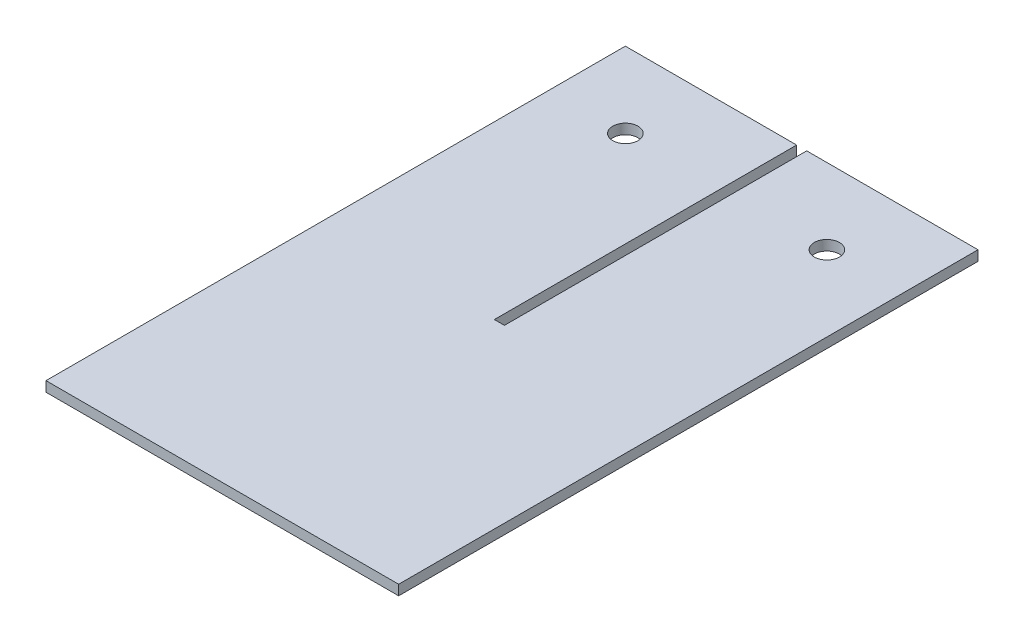
ISO-10303-21;
HEADER;
FILE_DESCRIPTION(('STEP AP214'),'2;1');
FILE_NAME('part.step','',(''),(''),'','','');
FILE_SCHEMA(('AUTOMOTIVE_DESIGN { 1 0 10303 214 1 1 1 1 }'));
ENDSEC;
DATA;
#1=APPLICATION_CONTEXT('core data for automotive mechanical design processes');
#2=APPLICATION_PROTOCOL_DEFINITION('international standard','automotive_design',2000,#1);
#3=PRODUCT_CONTEXT('',#1,'mechanical');
#4=PRODUCT('Part','Part','',(#3));
#5=PRODUCT_RELATED_PRODUCT_CATEGORY('part','',(#4));
#6=PRODUCT_DEFINITION_FORMATION('','',#4);
#7=PRODUCT_DEFINITION_CONTEXT('part definition',#1,'design');
#8=PRODUCT_DEFINITION('design','',#6,#7);
#9=PRODUCT_DEFINITION_SHAPE('','',#8);
#10=(LENGTH_UNIT() NAMED_UNIT(*) SI_UNIT(.MILLI.,.METRE.));
#11=(NAMED_UNIT(*) PLANE_ANGLE_UNIT() SI_UNIT($,.RADIAN.));
#12=(NAMED_UNIT(*) SI_UNIT($,.STERADIAN.) SOLID_ANGLE_UNIT());
#13=UNCERTAINTY_MEASURE_WITH_UNIT(LENGTH_MEASURE(1.E-05),#10,'distance_accuracy_value','');
#14=(GEOMETRIC_REPRESENTATION_CONTEXT(3) GLOBAL_UNCERTAINTY_ASSIGNED_CONTEXT((#13)) GLOBAL_UNIT_ASSIGNED_CONTEXT((#10,
#11,#12)) REPRESENTATION_CONTEXT('',''));
#15=CARTESIAN_POINT('',(0.,0.,0.));
#16=DIRECTION('',(0.,0.,1.));
#17=DIRECTION('',(1.,0.,0.));
#18=AXIS2_PLACEMENT_3D('',#15,#16,#17);
#19=CARTESIAN_POINT('',(0.,2.,0.));
#20=DIRECTION('',(0.,1.,0.));
#21=DIRECTION('',(0.,0.,1.));
#22=AXIS2_PLACEMENT_3D('',#19,#20,#21);
#23=PLANE('',#22);
#24=CARTESIAN_POINT('',(-20.,2.,-42.5));
#25=DIRECTION('',(0.,1.,0.));
#26=DIRECTION('',(0.,0.,1.));
#27=AXIS2_PLACEMENT_3D('',#24,#25,#26);
#28=CIRCLE('',#27,2.5);
#29=CARTESIAN_POINT('',(-20.,2.,-40.));
#30=VERTEX_POINT('',#29);
#31=EDGE_CURVE('E140',#30,#30,#28,.T.);
#32=ORIENTED_EDGE('',*,*,#31,.F.);
#33=EDGE_LOOP('',(#32));
#34=FACE_BOUND('',#33,.T.);
#35=DIRECTION('',(0.,0.,-1.));
#36=VECTOR('',#35,1.);
#37=CARTESIAN_POINT('',(35.,2.,-57.5));
#38=LINE('',#37,#36);
#39=CARTESIAN_POINT('',(35.,2.,57.5));
#40=VERTEX_POINT('',#39);
#41=CARTESIAN_POINT('',(35.,2.,-57.5));
#42=VERTEX_POINT('',#41);
#43=EDGE_CURVE('E151',#40,#42,#38,.T.);
#44=ORIENTED_EDGE('',*,*,#43,.T.);
#45=DIRECTION('',(-1.,0.,0.));
#46=VECTOR('',#45,1.);
#47=CARTESIAN_POINT('',(0.999999999999999,2.,-57.5));
#48=LINE('',#47,#46);
#49=CARTESIAN_POINT('',(0.999999999999999,2.,-57.5));
#50=VERTEX_POINT('',#49);
#51=EDGE_CURVE('E99',#42,#50,#48,.T.);
#52=ORIENTED_EDGE('',*,*,#51,.T.);
#53=DIRECTION('',(0.,0.,1.));
#54=VECTOR('',#53,1.);
#55=CARTESIAN_POINT('',(1.00000000000001,2.,2.5));
#56=LINE('',#55,#54);
#57=CARTESIAN_POINT('',(1.00000000000001,2.,2.5));
#58=VERTEX_POINT('',#57);
#59=EDGE_CURVE('E166',#50,#58,#56,.T.);
#60=ORIENTED_EDGE('',*,*,#59,.T.);
#61=DIRECTION('',(-1.,0.,0.));
#62=VECTOR('',#61,1.);
#63=CARTESIAN_POINT('',(1.00000000000001,2.,2.5));
#64=LINE('',#63,#62);
#65=CARTESIAN_POINT('',(-0.999999999999994,2.,2.5));
#66=VERTEX_POINT('',#65);
#67=EDGE_CURVE('E179',#58,#66,#64,.T.);
#68=ORIENTED_EDGE('',*,*,#67,.T.);
#69=DIRECTION('',(0.,0.,-1.));
#70=VECTOR('',#69,1.);
#71=CARTESIAN_POINT('',(-0.999999999999994,2.,2.5));
#72=LINE('',#71,#70);
#73=CARTESIAN_POINT('',(-1.,2.,-57.5));
#74=VERTEX_POINT('',#73);
#75=EDGE_CURVE('E118',#66,#74,#72,.T.);
#76=ORIENTED_EDGE('',*,*,#75,.T.);
#77=DIRECTION('',(-1.,0.,0.));
#78=VECTOR('',#77,1.);
#79=CARTESIAN_POINT('',(-35.,2.,-57.5));
#80=LINE('',#79,#78);
#81=CARTESIAN_POINT('',(-35.,2.,-57.5));
#82=VERTEX_POINT('',#81);
#83=EDGE_CURVE('E112',#74,#82,#80,.T.);
#84=ORIENTED_EDGE('',*,*,#83,.T.);
#85=DIRECTION('',(0.,0.,1.));
#86=VECTOR('',#85,1.);
#87=CARTESIAN_POINT('',(-35.,2.,-57.5));
#88=LINE('',#87,#86);
#89=CARTESIAN_POINT('',(-35.,2.,57.5));
#90=VERTEX_POINT('',#89);
#91=EDGE_CURVE('E116',#82,#90,#88,.T.);
#92=ORIENTED_EDGE('',*,*,#91,.T.);
#93=DIRECTION('',(1.,0.,0.));
#94=VECTOR('',#93,1.);
#95=CARTESIAN_POINT('',(-35.,2.,57.5));
#96=LINE('',#95,#94);
#97=EDGE_CURVE('E56',#90,#40,#96,.T.);
#98=ORIENTED_EDGE('',*,*,#97,.T.);
#99=EDGE_LOOP('',(#44,#52,#60,#68,#76,#84,#92,#98));
#100=FACE_BOUND('',#99,.T.);
#101=CARTESIAN_POINT('',(20.,2.,-42.5));
#102=DIRECTION('',(0.,1.,0.));
#103=DIRECTION('',(0.,0.,1.));
#104=AXIS2_PLACEMENT_3D('',#101,#102,#103);
#105=CIRCLE('',#104,2.5);
#106=CARTESIAN_POINT('',(20.,2.,-40.));
#107=VERTEX_POINT('',#106);
#108=EDGE_CURVE('E188',#107,#107,#105,.T.);
#109=ORIENTED_EDGE('',*,*,#108,.F.);
#110=EDGE_LOOP('',(#109));
#111=FACE_BOUND('',#110,.T.);
#112=ADVANCED_FACE('F39',(#34,#100,#111),#23,.T.);
#113=CARTESIAN_POINT('',(0.,0.,0.));
#114=DIRECTION('',(0.,1.,0.));
#115=DIRECTION('',(0.,0.,1.));
#116=AXIS2_PLACEMENT_3D('',#113,#114,#115);
#117=PLANE('',#116);
#118=DIRECTION('',(0.,0.,-1.));
#119=VECTOR('',#118,1.);
#120=CARTESIAN_POINT('',(35.,0.,-57.5));
#121=LINE('',#120,#119);
#122=CARTESIAN_POINT('',(35.,0.,57.5));
#123=VERTEX_POINT('',#122);
#124=CARTESIAN_POINT('',(35.,0.,-57.5));
#125=VERTEX_POINT('',#124);
#126=EDGE_CURVE('E136',#123,#125,#121,.T.);
#127=ORIENTED_EDGE('',*,*,#126,.F.);
#128=DIRECTION('',(1.,0.,0.));
#129=VECTOR('',#128,1.);
#130=CARTESIAN_POINT('',(-35.,0.,57.5));
#131=LINE('',#130,#129);
#132=CARTESIAN_POINT('',(-35.,0.,57.5));
#133=VERTEX_POINT('',#132);
#134=EDGE_CURVE('E91',#133,#123,#131,.T.);
#135=ORIENTED_EDGE('',*,*,#134,.F.);
#136=DIRECTION('',(0.,0.,1.));
#137=VECTOR('',#136,1.);
#138=CARTESIAN_POINT('',(-35.,0.,-57.5));
#139=LINE('',#138,#137);
#140=CARTESIAN_POINT('',(-35.,0.,-57.5));
#141=VERTEX_POINT('',#140);
#142=EDGE_CURVE('E85',#141,#133,#139,.T.);
#143=ORIENTED_EDGE('',*,*,#142,.F.);
#144=DIRECTION('',(-1.,0.,0.));
#145=VECTOR('',#144,1.);
#146=CARTESIAN_POINT('',(-35.,0.,-57.5));
#147=LINE('',#146,#145);
#148=CARTESIAN_POINT('',(-1.,0.,-57.5));
#149=VERTEX_POINT('',#148);
#150=EDGE_CURVE('E126',#149,#141,#147,.T.);
#151=ORIENTED_EDGE('',*,*,#150,.F.);
#152=DIRECTION('',(0.,0.,-1.));
#153=VECTOR('',#152,1.);
#154=CARTESIAN_POINT('',(-0.999999999999994,0.,2.5));
#155=LINE('',#154,#153);
#156=CARTESIAN_POINT('',(-0.999999999999994,0.,2.5));
#157=VERTEX_POINT('',#156);
#158=EDGE_CURVE('E146',#157,#149,#155,.T.);
#159=ORIENTED_EDGE('',*,*,#158,.F.);
#160=DIRECTION('',(-1.,0.,0.));
#161=VECTOR('',#160,1.);
#162=CARTESIAN_POINT('',(1.00000000000001,0.,2.5));
#163=LINE('',#162,#161);
#164=CARTESIAN_POINT('',(1.00000000000001,0.,2.5));
#165=VERTEX_POINT('',#164);
#166=EDGE_CURVE('E144',#165,#157,#163,.T.);
#167=ORIENTED_EDGE('',*,*,#166,.F.);
#168=DIRECTION('',(0.,0.,1.));
#169=VECTOR('',#168,1.);
#170=CARTESIAN_POINT('',(1.00000000000001,0.,2.5));
#171=LINE('',#170,#169);
#172=CARTESIAN_POINT('',(0.999999999999999,0.,-57.5));
#173=VERTEX_POINT('',#172);
#174=EDGE_CURVE('E142',#173,#165,#171,.T.);
#175=ORIENTED_EDGE('',*,*,#174,.F.);
#176=DIRECTION('',(-1.,0.,0.));
#177=VECTOR('',#176,1.);
#178=CARTESIAN_POINT('',(0.999999999999999,0.,-57.5));
#179=LINE('',#178,#177);
#180=EDGE_CURVE('E139',#125,#173,#179,.T.);
#181=ORIENTED_EDGE('',*,*,#180,.F.);
#182=EDGE_LOOP('',(#127,#135,#143,#151,#159,#167,#175,#181));
#183=FACE_BOUND('',#182,.T.);
#184=CARTESIAN_POINT('',(-20.,0.,-42.5));
#185=DIRECTION('',(0.,1.,0.));
#186=DIRECTION('',(0.,0.,1.));
#187=AXIS2_PLACEMENT_3D('',#184,#185,#186);
#188=CIRCLE('',#187,2.5);
#189=CARTESIAN_POINT('',(-20.,0.,-40.));
#190=VERTEX_POINT('',#189);
#191=EDGE_CURVE('E185',#190,#190,#188,.T.);
#192=ORIENTED_EDGE('',*,*,#191,.T.);
#193=EDGE_LOOP('',(#192));
#194=FACE_BOUND('',#193,.T.);
#195=CARTESIAN_POINT('',(20.,0.,-42.5));
#196=DIRECTION('',(0.,1.,0.));
#197=DIRECTION('',(0.,0.,1.));
#198=AXIS2_PLACEMENT_3D('',#195,#196,#197);
#199=CIRCLE('',#198,2.5);
#200=CARTESIAN_POINT('',(20.,0.,-40.));
#201=VERTEX_POINT('',#200);
#202=EDGE_CURVE('E191',#201,#201,#199,.T.);
#203=ORIENTED_EDGE('',*,*,#202,.T.);
#204=EDGE_LOOP('',(#203));
#205=FACE_BOUND('',#204,.T.);
#206=ADVANCED_FACE('F170',(#183,#194,#205),#117,.F.);
#207=CARTESIAN_POINT('',(35.,2.,-57.5));
#208=DIRECTION('',(-1.,0.,0.));
#209=DIRECTION('',(0.,0.,1.));
#210=AXIS2_PLACEMENT_3D('',#207,#208,#209);
#211=PLANE('',#210);
#212=ORIENTED_EDGE('',*,*,#126,.T.);
#213=DIRECTION('',(0.,-1.,0.));
#214=VECTOR('',#213,1.);
#215=CARTESIAN_POINT('',(35.,2.,-57.5));
#216=LINE('',#215,#214);
#217=EDGE_CURVE('E11',#42,#125,#216,.T.);
#218=ORIENTED_EDGE('',*,*,#217,.F.);
#219=ORIENTED_EDGE('',*,*,#43,.F.);
#220=DIRECTION('',(0.,-1.,0.));
#221=VECTOR('',#220,1.);
#222=CARTESIAN_POINT('',(35.,2.,57.5));
#223=LINE('',#222,#221);
#224=EDGE_CURVE('E132',#40,#123,#223,.T.);
#225=ORIENTED_EDGE('',*,*,#224,.T.);
#226=EDGE_LOOP('',(#212,#218,#219,#225));
#227=FACE_BOUND('',#226,.T.);
#228=ADVANCED_FACE('F41',(#227),#211,.F.);
#229=CARTESIAN_POINT('',(0.999999999999999,2.,-57.5));
#230=DIRECTION('',(0.,0.,1.));
#231=DIRECTION('',(1.,0.,0.));
#232=AXIS2_PLACEMENT_3D('',#229,#230,#231);
#233=PLANE('',#232);
#234=ORIENTED_EDGE('',*,*,#180,.T.);
#235=DIRECTION('',(0.,-1.,0.));
#236=VECTOR('',#235,1.);
#237=CARTESIAN_POINT('',(0.999999999999999,2.,-57.5));
#238=LINE('',#237,#236);
#239=EDGE_CURVE('E48',#50,#173,#238,.T.);
#240=ORIENTED_EDGE('',*,*,#239,.F.);
#241=ORIENTED_EDGE('',*,*,#51,.F.);
#242=ORIENTED_EDGE('',*,*,#217,.T.);
#243=EDGE_LOOP('',(#234,#240,#241,#242));
#244=FACE_BOUND('',#243,.T.);
#245=ADVANCED_FACE('F223',(#244),#233,.F.);
#246=CARTESIAN_POINT('',(1.00000000000001,2.,2.5));
#247=DIRECTION('',(1.,0.,0.));
#248=DIRECTION('',(0.,0.,-1.));
#249=AXIS2_PLACEMENT_3D('',#246,#247,#248);
#250=PLANE('',#249);
#251=ORIENTED_EDGE('',*,*,#174,.T.);
#252=DIRECTION('',(0.,-1.,0.));
#253=VECTOR('',#252,1.);
#254=CARTESIAN_POINT('',(1.00000000000001,2.,2.5));
#255=LINE('',#254,#253);
#256=EDGE_CURVE('E158',#58,#165,#255,.T.);
#257=ORIENTED_EDGE('',*,*,#256,.F.);
#258=ORIENTED_EDGE('',*,*,#59,.F.);
#259=ORIENTED_EDGE('',*,*,#239,.T.);
#260=EDGE_LOOP('',(#251,#257,#258,#259));
#261=FACE_BOUND('',#260,.T.);
#262=ADVANCED_FACE('F164',(#261),#250,.F.);
#263=CARTESIAN_POINT('',(1.00000000000001,2.,2.5));
#264=DIRECTION('',(0.,0.,1.));
#265=DIRECTION('',(1.,0.,0.));
#266=AXIS2_PLACEMENT_3D('',#263,#264,#265);
#267=PLANE('',#266);
#268=ORIENTED_EDGE('',*,*,#166,.T.);
#269=DIRECTION('',(0.,-1.,0.));
#270=VECTOR('',#269,1.);
#271=CARTESIAN_POINT('',(-0.999999999999994,2.,2.5));
#272=LINE('',#271,#270);
#273=EDGE_CURVE('E155',#66,#157,#272,.T.);
#274=ORIENTED_EDGE('',*,*,#273,.F.);
#275=ORIENTED_EDGE('',*,*,#67,.F.);
#276=ORIENTED_EDGE('',*,*,#256,.T.);
#277=EDGE_LOOP('',(#268,#274,#275,#276));
#278=FACE_BOUND('',#277,.T.);
#279=ADVANCED_FACE('F175',(#278),#267,.F.);
#280=CARTESIAN_POINT('',(-0.999999999999994,2.,2.5));
#281=DIRECTION('',(-1.,0.,0.));
#282=DIRECTION('',(0.,0.,1.));
#283=AXIS2_PLACEMENT_3D('',#280,#281,#282);
#284=PLANE('',#283);
#285=ORIENTED_EDGE('',*,*,#158,.T.);
#286=DIRECTION('',(0.,-1.,0.));
#287=VECTOR('',#286,1.);
#288=CARTESIAN_POINT('',(-1.,2.,-57.5));
#289=LINE('',#288,#287);
#290=EDGE_CURVE('E127',#74,#149,#289,.T.);
#291=ORIENTED_EDGE('',*,*,#290,.F.);
#292=ORIENTED_EDGE('',*,*,#75,.F.);
#293=ORIENTED_EDGE('',*,*,#273,.T.);
#294=EDGE_LOOP('',(#285,#291,#292,#293));
#295=FACE_BOUND('',#294,.T.);
#296=ADVANCED_FACE('F178',(#295),#284,.F.);
#297=CARTESIAN_POINT('',(-35.,2.,-57.5));
#298=DIRECTION('',(0.,0.,1.));
#299=DIRECTION('',(1.,0.,0.));
#300=AXIS2_PLACEMENT_3D('',#297,#298,#299);
#301=PLANE('',#300);
#302=ORIENTED_EDGE('',*,*,#150,.T.);
#303=DIRECTION('',(0.,-1.,0.));
#304=VECTOR('',#303,1.);
#305=CARTESIAN_POINT('',(-35.,2.,-57.5));
#306=LINE('',#305,#304);
#307=EDGE_CURVE('E123',#82,#141,#306,.T.);
#308=ORIENTED_EDGE('',*,*,#307,.F.);
#309=ORIENTED_EDGE('',*,*,#83,.F.);
#310=ORIENTED_EDGE('',*,*,#290,.T.);
#311=EDGE_LOOP('',(#302,#308,#309,#310));
#312=FACE_BOUND('',#311,.T.);
#313=ADVANCED_FACE('F124',(#312),#301,.F.);
#314=CARTESIAN_POINT('',(-35.,2.,-57.5));
#315=DIRECTION('',(1.,0.,0.));
#316=DIRECTION('',(0.,0.,-1.));
#317=AXIS2_PLACEMENT_3D('',#314,#315,#316);
#318=PLANE('',#317);
#319=ORIENTED_EDGE('',*,*,#142,.T.);
#320=DIRECTION('',(0.,-1.,0.));
#321=VECTOR('',#320,1.);
#322=CARTESIAN_POINT('',(-35.,2.,57.5));
#323=LINE('',#322,#321);
#324=EDGE_CURVE('E128',#90,#133,#323,.T.);
#325=ORIENTED_EDGE('',*,*,#324,.F.);
#326=ORIENTED_EDGE('',*,*,#91,.F.);
#327=ORIENTED_EDGE('',*,*,#307,.T.);
#328=EDGE_LOOP('',(#319,#325,#326,#327));
#329=FACE_BOUND('',#328,.T.);
#330=ADVANCED_FACE('F130',(#329),#318,.F.);
#331=CARTESIAN_POINT('',(-35.,2.,57.5));
#332=DIRECTION('',(0.,0.,-1.));
#333=DIRECTION('',(-1.,0.,0.));
#334=AXIS2_PLACEMENT_3D('',#331,#332,#333);
#335=PLANE('',#334);
#336=ORIENTED_EDGE('',*,*,#134,.T.);
#337=ORIENTED_EDGE('',*,*,#224,.F.);
#338=ORIENTED_EDGE('',*,*,#97,.F.);
#339=ORIENTED_EDGE('',*,*,#324,.T.);
#340=EDGE_LOOP('',(#336,#337,#338,#339));
#341=FACE_BOUND('',#340,.T.);
#342=ADVANCED_FACE('F211',(#341),#335,.F.);
#343=CARTESIAN_POINT('',(-20.,2.,-42.5));
#344=DIRECTION('',(0.,-1.,0.));
#345=DIRECTION('',(0.,0.,-1.));
#346=AXIS2_PLACEMENT_3D('',#343,#344,#345);
#347=CYLINDRICAL_SURFACE('',#346,2.5);
#348=ORIENTED_EDGE('',*,*,#31,.T.);
#349=EDGE_LOOP('',(#348));
#350=FACE_BOUND('',#349,.T.);
#351=ORIENTED_EDGE('',*,*,#191,.F.);
#352=EDGE_LOOP('',(#351));
#353=FACE_BOUND('',#352,.T.);
#354=ADVANCED_FACE('F208',(#350,#353),#347,.F.);
#355=CARTESIAN_POINT('',(20.,2.,-42.5));
#356=DIRECTION('',(0.,-1.,0.));
#357=DIRECTION('',(0.,0.,-1.));
#358=AXIS2_PLACEMENT_3D('',#355,#356,#357);
#359=CYLINDRICAL_SURFACE('',#358,2.5);
#360=ORIENTED_EDGE('',*,*,#108,.T.);
#361=EDGE_LOOP('',(#360));
#362=FACE_BOUND('',#361,.T.);
#363=ORIENTED_EDGE('',*,*,#202,.F.);
#364=EDGE_LOOP('',(#363));
#365=FACE_BOUND('',#364,.T.);
#366=ADVANCED_FACE('F197',(#362,#365),#359,.F.);
#367=CLOSED_SHELL('',(#112,#206,#228,#245,#262,#279,#296,#313,#330,#342,#354,#366));
#368=MANIFOLD_SOLID_BREP('B2',#367);
#369=ADVANCED_BREP_SHAPE_REPRESENTATION('',(#18,#368),#14);
#370=SHAPE_DEFINITION_REPRESENTATION(#9,#369);
ENDSEC;
END-ISO-10303-21;
